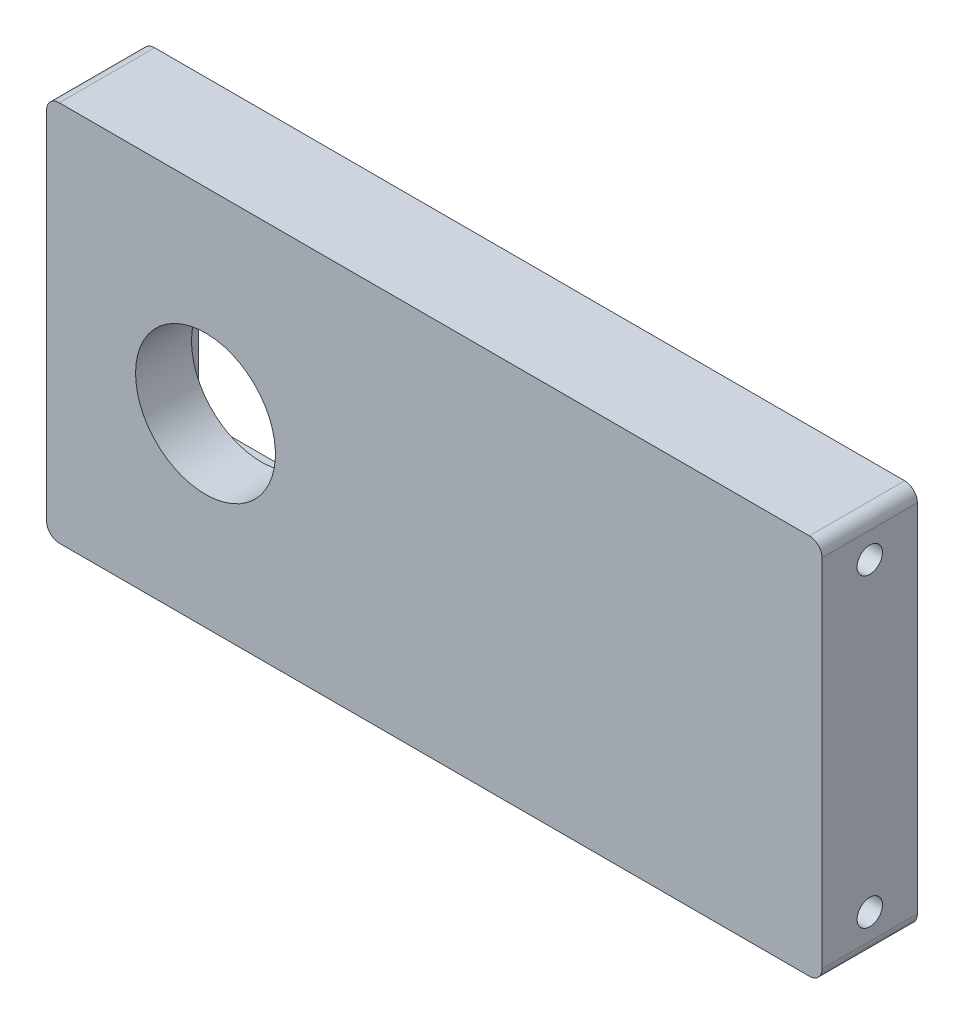
ISO-10303-21;
HEADER;
FILE_DESCRIPTION(('STEP AP214'),'2;1');
FILE_NAME('part.step','',(''),(''),'','','');
FILE_SCHEMA(('AUTOMOTIVE_DESIGN { 1 0 10303 214 1 1 1 1 }'));
ENDSEC;
DATA;
#1=APPLICATION_CONTEXT('core data for automotive mechanical design processes');
#2=APPLICATION_PROTOCOL_DEFINITION('international standard','automotive_design',2000,#1);
#3=PRODUCT_CONTEXT('',#1,'mechanical');
#4=PRODUCT('Part','Part','',(#3));
#5=PRODUCT_RELATED_PRODUCT_CATEGORY('part','',(#4));
#6=PRODUCT_DEFINITION_FORMATION('','',#4);
#7=PRODUCT_DEFINITION_CONTEXT('part definition',#1,'design');
#8=PRODUCT_DEFINITION('design','',#6,#7);
#9=PRODUCT_DEFINITION_SHAPE('','',#8);
#10=(LENGTH_UNIT() NAMED_UNIT(*) SI_UNIT(.MILLI.,.METRE.));
#11=(NAMED_UNIT(*) PLANE_ANGLE_UNIT() SI_UNIT($,.RADIAN.));
#12=(NAMED_UNIT(*) SI_UNIT($,.STERADIAN.) SOLID_ANGLE_UNIT());
#13=UNCERTAINTY_MEASURE_WITH_UNIT(LENGTH_MEASURE(1.E-05),#10,'distance_accuracy_value','');
#14=(GEOMETRIC_REPRESENTATION_CONTEXT(3) GLOBAL_UNCERTAINTY_ASSIGNED_CONTEXT((#13)) GLOBAL_UNIT_ASSIGNED_CONTEXT((#10,
#11,#12)) REPRESENTATION_CONTEXT('',''));
#15=CARTESIAN_POINT('',(0.,0.,0.));
#16=DIRECTION('',(0.,0.,1.));
#17=DIRECTION('',(1.,0.,0.));
#18=AXIS2_PLACEMENT_3D('',#15,#16,#17);
#19=CARTESIAN_POINT('',(-36.,-0.850791996043654,27.5));
#20=DIRECTION('',(0.,0.,-1.));
#21=DIRECTION('',(-1.,0.,0.));
#22=AXIS2_PLACEMENT_3D('',#19,#20,#21);
#23=CYLINDRICAL_SURFACE('',#22,11.);
#24=CARTESIAN_POINT('',(-36.,-0.850791996043654,7.5));
#25=DIRECTION('',(0.,0.,-1.));
#26=DIRECTION('',(-1.,0.,0.));
#27=AXIS2_PLACEMENT_3D('',#24,#25,#26);
#28=CIRCLE('',#27,11.);
#29=CARTESIAN_POINT('',(-47.,-0.850791996043654,7.5));
#30=VERTEX_POINT('',#29);
#31=EDGE_CURVE('E228',#30,#30,#28,.T.);
#32=ORIENTED_EDGE('',*,*,#31,.F.);
#33=EDGE_LOOP('',(#32));
#34=FACE_BOUND('',#33,.T.);
#35=CARTESIAN_POINT('',(-36.,-0.850791996043654,-1.3));
#36=DIRECTION('',(0.,0.,-1.));
#37=DIRECTION('',(-1.,0.,0.));
#38=AXIS2_PLACEMENT_3D('',#35,#36,#37);
#39=CIRCLE('',#38,11.);
#40=CARTESIAN_POINT('',(-47.,-0.850791996043654,-1.3));
#41=VERTEX_POINT('',#40);
#42=EDGE_CURVE('E43',#41,#41,#39,.F.);
#43=ORIENTED_EDGE('',*,*,#42,.F.);
#44=EDGE_LOOP('',(#43));
#45=FACE_BOUND('',#44,.T.);
#46=ADVANCED_FACE('F39',(#34,#45),#23,.F.);
#47=CARTESIAN_POINT('',(59.,28.,7.5));
#48=DIRECTION('',(0.,0.,-1.));
#49=DIRECTION('',(-1.,0.,0.));
#50=AXIS2_PLACEMENT_3D('',#47,#48,#49);
#51=CYLINDRICAL_SURFACE('',#50,2.00000000000001);
#52=CARTESIAN_POINT('',(59.,28.,-7.5));
#53=DIRECTION('',(0.,0.,1.));
#54=DIRECTION('',(-1.,0.,0.));
#55=AXIS2_PLACEMENT_3D('',#52,#53,#54);
#56=CIRCLE('',#55,2.00000000000001);
#57=CARTESIAN_POINT('',(61.,28.,-7.5));
#58=VERTEX_POINT('',#57);
#59=CARTESIAN_POINT('',(59.,30.,-7.5));
#60=VERTEX_POINT('',#59);
#61=EDGE_CURVE('E154',#58,#60,#56,.T.);
#62=ORIENTED_EDGE('',*,*,#61,.T.);
#63=DIRECTION('',(0.,0.,-1.));
#64=VECTOR('',#63,1.);
#65=CARTESIAN_POINT('',(59.,30.,7.5));
#66=LINE('',#65,#64);
#67=CARTESIAN_POINT('',(59.,30.,7.5));
#68=VERTEX_POINT('',#67);
#69=EDGE_CURVE('E11',#68,#60,#66,.T.);
#70=ORIENTED_EDGE('',*,*,#69,.F.);
#71=CARTESIAN_POINT('',(59.,28.,7.5));
#72=DIRECTION('',(0.,0.,1.));
#73=DIRECTION('',(-1.,0.,0.));
#74=AXIS2_PLACEMENT_3D('',#71,#72,#73);
#75=CIRCLE('',#74,2.00000000000001);
#76=CARTESIAN_POINT('',(61.,28.,7.5));
#77=VERTEX_POINT('',#76);
#78=EDGE_CURVE('E178',#77,#68,#75,.T.);
#79=ORIENTED_EDGE('',*,*,#78,.F.);
#80=DIRECTION('',(0.,0.,-1.));
#81=VECTOR('',#80,1.);
#82=CARTESIAN_POINT('',(61.,28.,7.5));
#83=LINE('',#82,#81);
#84=EDGE_CURVE('E150',#77,#58,#83,.T.);
#85=ORIENTED_EDGE('',*,*,#84,.T.);
#86=EDGE_LOOP('',(#62,#70,#79,#85));
#87=FACE_BOUND('',#86,.T.);
#88=ADVANCED_FACE('F41',(#87),#51,.T.);
#89=CARTESIAN_POINT('',(-59.,30.,7.5));
#90=DIRECTION('',(0.,-1.,0.));
#91=DIRECTION('',(0.,0.,-1.));
#92=AXIS2_PLACEMENT_3D('',#89,#90,#91);
#93=PLANE('',#92);
#94=DIRECTION('',(-1.,0.,0.));
#95=VECTOR('',#94,1.);
#96=CARTESIAN_POINT('',(-59.,30.,-7.5));
#97=LINE('',#96,#95);
#98=CARTESIAN_POINT('',(-59.,30.,-7.5));
#99=VERTEX_POINT('',#98);
#100=EDGE_CURVE('E158',#60,#99,#97,.T.);
#101=ORIENTED_EDGE('',*,*,#100,.T.);
#102=DIRECTION('',(0.,0.,-1.));
#103=VECTOR('',#102,1.);
#104=CARTESIAN_POINT('',(-59.,30.,7.5));
#105=LINE('',#104,#103);
#106=CARTESIAN_POINT('',(-59.,30.,7.5));
#107=VERTEX_POINT('',#106);
#108=EDGE_CURVE('E49',#107,#99,#105,.T.);
#109=ORIENTED_EDGE('',*,*,#108,.F.);
#110=DIRECTION('',(-1.,0.,0.));
#111=VECTOR('',#110,1.);
#112=CARTESIAN_POINT('',(-59.,30.,7.5));
#113=LINE('',#112,#111);
#114=EDGE_CURVE('E106',#68,#107,#113,.T.);
#115=ORIENTED_EDGE('',*,*,#114,.F.);
#116=ORIENTED_EDGE('',*,*,#69,.T.);
#117=EDGE_LOOP('',(#101,#109,#115,#116));
#118=FACE_BOUND('',#117,.T.);
#119=ADVANCED_FACE('F414',(#118),#93,.F.);
#120=CARTESIAN_POINT('',(-59.,28.,7.5));
#121=DIRECTION('',(0.,0.,-1.));
#122=DIRECTION('',(-1.,0.,0.));
#123=AXIS2_PLACEMENT_3D('',#120,#121,#122);
#124=CYLINDRICAL_SURFACE('',#123,2.);
#125=CARTESIAN_POINT('',(-59.,28.,-7.5));
#126=DIRECTION('',(0.,0.,1.));
#127=DIRECTION('',(1.,0.,0.));
#128=AXIS2_PLACEMENT_3D('',#125,#126,#127);
#129=CIRCLE('',#128,2.);
#130=CARTESIAN_POINT('',(-61.,28.,-7.5));
#131=VERTEX_POINT('',#130);
#132=EDGE_CURVE('E162',#99,#131,#129,.T.);
#133=ORIENTED_EDGE('',*,*,#132,.T.);
#134=DIRECTION('',(0.,0.,-1.));
#135=VECTOR('',#134,1.);
#136=CARTESIAN_POINT('',(-61.,28.,7.5));
#137=LINE('',#136,#135);
#138=CARTESIAN_POINT('',(-61.,28.,7.5));
#139=VERTEX_POINT('',#138);
#140=EDGE_CURVE('E189',#139,#131,#137,.T.);
#141=ORIENTED_EDGE('',*,*,#140,.F.);
#142=CARTESIAN_POINT('',(-59.,28.,7.5));
#143=DIRECTION('',(0.,0.,1.));
#144=DIRECTION('',(1.,0.,0.));
#145=AXIS2_PLACEMENT_3D('',#142,#143,#144);
#146=CIRCLE('',#145,2.);
#147=EDGE_CURVE('E200',#107,#139,#146,.T.);
#148=ORIENTED_EDGE('',*,*,#147,.F.);
#149=ORIENTED_EDGE('',*,*,#108,.T.);
#150=EDGE_LOOP('',(#133,#141,#148,#149));
#151=FACE_BOUND('',#150,.T.);
#152=ADVANCED_FACE('F198',(#151),#124,.T.);
#153=CARTESIAN_POINT('',(-61.,28.,7.5));
#154=DIRECTION('',(1.,0.,0.));
#155=DIRECTION('',(0.,1.,0.));
#156=AXIS2_PLACEMENT_3D('',#153,#154,#155);
#157=PLANE('',#156);
#158=DIRECTION('',(0.,-1.,0.));
#159=VECTOR('',#158,1.);
#160=CARTESIAN_POINT('',(-61.,28.,-7.5));
#161=LINE('',#160,#159);
#162=CARTESIAN_POINT('',(-61.,-28.,-7.5));
#163=VERTEX_POINT('',#162);
#164=EDGE_CURVE('E165',#131,#163,#161,.T.);
#165=ORIENTED_EDGE('',*,*,#164,.T.);
#166=DIRECTION('',(0.,0.,-1.));
#167=VECTOR('',#166,1.);
#168=CARTESIAN_POINT('',(-61.,-28.,7.5));
#169=LINE('',#168,#167);
#170=CARTESIAN_POINT('',(-61.,-28.,7.5));
#171=VERTEX_POINT('',#170);
#172=EDGE_CURVE('E185',#171,#163,#169,.T.);
#173=ORIENTED_EDGE('',*,*,#172,.F.);
#174=DIRECTION('',(0.,-1.,0.));
#175=VECTOR('',#174,1.);
#176=CARTESIAN_POINT('',(-61.,28.,7.5));
#177=LINE('',#176,#175);
#178=EDGE_CURVE('E213',#139,#171,#177,.T.);
#179=ORIENTED_EDGE('',*,*,#178,.F.);
#180=ORIENTED_EDGE('',*,*,#140,.T.);
#181=EDGE_LOOP('',(#165,#173,#179,#180));
#182=FACE_BOUND('',#181,.T.);
#183=ADVANCED_FACE('F208',(#182),#157,.F.);
#184=CARTESIAN_POINT('',(-59.,-28.,7.5));
#185=DIRECTION('',(0.,0.,-1.));
#186=DIRECTION('',(-1.,0.,0.));
#187=AXIS2_PLACEMENT_3D('',#184,#185,#186);
#188=CYLINDRICAL_SURFACE('',#187,2.);
#189=CARTESIAN_POINT('',(-59.,-28.,-7.5));
#190=DIRECTION('',(0.,0.,1.));
#191=DIRECTION('',(1.,0.,0.));
#192=AXIS2_PLACEMENT_3D('',#189,#190,#191);
#193=CIRCLE('',#192,2.);
#194=CARTESIAN_POINT('',(-59.,-30.,-7.5));
#195=VERTEX_POINT('',#194);
#196=EDGE_CURVE('E168',#163,#195,#193,.T.);
#197=ORIENTED_EDGE('',*,*,#196,.T.);
#198=DIRECTION('',(0.,0.,-1.));
#199=VECTOR('',#198,1.);
#200=CARTESIAN_POINT('',(-59.,-30.,7.5));
#201=LINE('',#200,#199);
#202=CARTESIAN_POINT('',(-59.,-30.,7.5));
#203=VERTEX_POINT('',#202);
#204=EDGE_CURVE('E143',#203,#195,#201,.T.);
#205=ORIENTED_EDGE('',*,*,#204,.F.);
#206=CARTESIAN_POINT('',(-59.,-28.,7.5));
#207=DIRECTION('',(0.,0.,1.));
#208=DIRECTION('',(1.,0.,0.));
#209=AXIS2_PLACEMENT_3D('',#206,#207,#208);
#210=CIRCLE('',#209,2.);
#211=EDGE_CURVE('E129',#171,#203,#210,.T.);
#212=ORIENTED_EDGE('',*,*,#211,.F.);
#213=ORIENTED_EDGE('',*,*,#172,.T.);
#214=EDGE_LOOP('',(#197,#205,#212,#213));
#215=FACE_BOUND('',#214,.T.);
#216=ADVANCED_FACE('F211',(#215),#188,.T.);
#217=CARTESIAN_POINT('',(-59.,-30.,7.5));
#218=DIRECTION('',(0.,1.,0.));
#219=DIRECTION('',(0.,0.,1.));
#220=AXIS2_PLACEMENT_3D('',#217,#218,#219);
#221=PLANE('',#220);
#222=DIRECTION('',(1.,0.,0.));
#223=VECTOR('',#222,1.);
#224=CARTESIAN_POINT('',(-59.,-30.,-7.5));
#225=LINE('',#224,#223);
#226=CARTESIAN_POINT('',(59.,-30.,-7.5));
#227=VERTEX_POINT('',#226);
#228=EDGE_CURVE('E139',#195,#227,#225,.T.);
#229=ORIENTED_EDGE('',*,*,#228,.T.);
#230=DIRECTION('',(0.,0.,-1.));
#231=VECTOR('',#230,1.);
#232=CARTESIAN_POINT('',(59.,-30.,7.5));
#233=LINE('',#232,#231);
#234=CARTESIAN_POINT('',(59.,-30.,7.5));
#235=VERTEX_POINT('',#234);
#236=EDGE_CURVE('E136',#235,#227,#233,.T.);
#237=ORIENTED_EDGE('',*,*,#236,.F.);
#238=DIRECTION('',(1.,0.,0.));
#239=VECTOR('',#238,1.);
#240=CARTESIAN_POINT('',(-59.,-30.,7.5));
#241=LINE('',#240,#239);
#242=EDGE_CURVE('E122',#203,#235,#241,.T.);
#243=ORIENTED_EDGE('',*,*,#242,.F.);
#244=ORIENTED_EDGE('',*,*,#204,.T.);
#245=EDGE_LOOP('',(#229,#237,#243,#244));
#246=FACE_BOUND('',#245,.T.);
#247=ADVANCED_FACE('F137',(#246),#221,.F.);
#248=CARTESIAN_POINT('',(59.,-28.,7.5));
#249=DIRECTION('',(0.,0.,-1.));
#250=DIRECTION('',(-1.,0.,0.));
#251=AXIS2_PLACEMENT_3D('',#248,#249,#250);
#252=CYLINDRICAL_SURFACE('',#251,2.00000000000001);
#253=CARTESIAN_POINT('',(59.,-28.,-7.5));
#254=DIRECTION('',(0.,0.,1.));
#255=DIRECTION('',(1.,0.,0.));
#256=AXIS2_PLACEMENT_3D('',#253,#254,#255);
#257=CIRCLE('',#256,2.00000000000001);
#258=CARTESIAN_POINT('',(61.,-28.,-7.5));
#259=VERTEX_POINT('',#258);
#260=EDGE_CURVE('E173',#227,#259,#257,.T.);
#261=ORIENTED_EDGE('',*,*,#260,.T.);
#262=DIRECTION('',(0.,0.,-1.));
#263=VECTOR('',#262,1.);
#264=CARTESIAN_POINT('',(61.,-28.,7.5));
#265=LINE('',#264,#263);
#266=CARTESIAN_POINT('',(61.,-28.,7.5));
#267=VERTEX_POINT('',#266);
#268=EDGE_CURVE('E144',#267,#259,#265,.T.);
#269=ORIENTED_EDGE('',*,*,#268,.F.);
#270=CARTESIAN_POINT('',(59.,-28.,7.5));
#271=DIRECTION('',(0.,0.,1.));
#272=DIRECTION('',(1.,0.,0.));
#273=AXIS2_PLACEMENT_3D('',#270,#271,#272);
#274=CIRCLE('',#273,2.00000000000001);
#275=EDGE_CURVE('E126',#235,#267,#274,.T.);
#276=ORIENTED_EDGE('',*,*,#275,.F.);
#277=ORIENTED_EDGE('',*,*,#236,.T.);
#278=EDGE_LOOP('',(#261,#269,#276,#277));
#279=FACE_BOUND('',#278,.T.);
#280=ADVANCED_FACE('F146',(#279),#252,.T.);
#281=CARTESIAN_POINT('',(61.,28.,7.5));
#282=DIRECTION('',(-1.,0.,0.));
#283=DIRECTION('',(0.,0.,1.));
#284=AXIS2_PLACEMENT_3D('',#281,#282,#283);
#285=PLANE('',#284);
#286=CARTESIAN_POINT('',(61.,24.,0.));
#287=DIRECTION('',(1.,0.,0.));
#288=DIRECTION('',(0.,1.,0.));
#289=AXIS2_PLACEMENT_3D('',#286,#287,#288);
#290=CIRCLE('',#289,2.);
#291=CARTESIAN_POINT('',(61.,26.,0.));
#292=VERTEX_POINT('',#291);
#293=EDGE_CURVE('E232',#292,#292,#290,.T.);
#294=ORIENTED_EDGE('',*,*,#293,.F.);
#295=EDGE_LOOP('',(#294));
#296=FACE_BOUND('',#295,.T.);
#297=CARTESIAN_POINT('',(61.,-24.,0.));
#298=DIRECTION('',(1.,0.,0.));
#299=DIRECTION('',(0.,-1.,0.));
#300=AXIS2_PLACEMENT_3D('',#297,#298,#299);
#301=CIRCLE('',#300,2.);
#302=CARTESIAN_POINT('',(61.,-26.,0.));
#303=VERTEX_POINT('',#302);
#304=EDGE_CURVE('E223',#303,#303,#301,.T.);
#305=ORIENTED_EDGE('',*,*,#304,.F.);
#306=EDGE_LOOP('',(#305));
#307=FACE_BOUND('',#306,.T.);
#308=DIRECTION('',(0.,1.,0.));
#309=VECTOR('',#308,1.);
#310=CARTESIAN_POINT('',(61.,28.,-7.5));
#311=LINE('',#310,#309);
#312=EDGE_CURVE('E98',#259,#58,#311,.T.);
#313=ORIENTED_EDGE('',*,*,#312,.T.);
#314=ORIENTED_EDGE('',*,*,#84,.F.);
#315=DIRECTION('',(0.,1.,0.));
#316=VECTOR('',#315,1.);
#317=CARTESIAN_POINT('',(61.,28.,7.5));
#318=LINE('',#317,#316);
#319=EDGE_CURVE('E65',#267,#77,#318,.T.);
#320=ORIENTED_EDGE('',*,*,#319,.F.);
#321=ORIENTED_EDGE('',*,*,#268,.T.);
#322=EDGE_LOOP('',(#313,#314,#320,#321));
#323=FACE_BOUND('',#322,.T.);
#324=ADVANCED_FACE('F439',(#296,#307,#323),#285,.F.);
#325=CARTESIAN_POINT('',(59.,28.,7.5));
#326=DIRECTION('',(0.,0.,-1.));
#327=DIRECTION('',(-1.,0.,0.));
#328=AXIS2_PLACEMENT_3D('',#325,#326,#327);
#329=PLANE('',#328);
#330=ORIENTED_EDGE('',*,*,#31,.T.);
#331=EDGE_LOOP('',(#330));
#332=FACE_BOUND('',#331,.T.);
#333=ORIENTED_EDGE('',*,*,#78,.T.);
#334=ORIENTED_EDGE('',*,*,#114,.T.);
#335=ORIENTED_EDGE('',*,*,#147,.T.);
#336=ORIENTED_EDGE('',*,*,#178,.T.);
#337=ORIENTED_EDGE('',*,*,#211,.T.);
#338=ORIENTED_EDGE('',*,*,#242,.T.);
#339=ORIENTED_EDGE('',*,*,#275,.T.);
#340=ORIENTED_EDGE('',*,*,#319,.T.);
#341=EDGE_LOOP('',(#333,#334,#335,#336,#337,#338,#339,#340));
#342=FACE_BOUND('',#341,.T.);
#343=ADVANCED_FACE('F124',(#332,#342),#329,.F.);
#344=CARTESIAN_POINT('',(59.,28.,-7.5));
#345=DIRECTION('',(0.,0.,-1.));
#346=DIRECTION('',(-1.,0.,0.));
#347=AXIS2_PLACEMENT_3D('',#344,#345,#346);
#348=PLANE('',#347);
#349=DIRECTION('',(0.,1.,0.));
#350=VECTOR('',#349,1.);
#351=CARTESIAN_POINT('',(-52.1,12.2492080039563,-7.5));
#352=LINE('',#351,#350);
#353=CARTESIAN_POINT('',(-52.1,-13.9507919960437,-7.5));
#354=VERTEX_POINT('',#353);
#355=CARTESIAN_POINT('',(-52.1,12.2492080039563,-7.5));
#356=VERTEX_POINT('',#355);
#357=EDGE_CURVE('E56',#354,#356,#352,.T.);
#358=ORIENTED_EDGE('',*,*,#357,.F.);
#359=DIRECTION('',(-0.707106781186549,0.707106781186546,0.));
#360=VECTOR('',#359,1.);
#361=CARTESIAN_POINT('',(-52.1,-13.9507919960437,-7.5));
#362=LINE('',#361,#360);
#363=CARTESIAN_POINT('',(-49.1,-16.9507919960437,-7.5));
#364=VERTEX_POINT('',#363);
#365=EDGE_CURVE('E273',#364,#354,#362,.T.);
#366=ORIENTED_EDGE('',*,*,#365,.F.);
#367=DIRECTION('',(-1.,0.,0.));
#368=VECTOR('',#367,1.);
#369=CARTESIAN_POINT('',(-22.9,-16.9507919960437,-7.5));
#370=LINE('',#369,#368);
#371=CARTESIAN_POINT('',(-22.9,-16.9507919960437,-7.5));
#372=VERTEX_POINT('',#371);
#373=EDGE_CURVE('E278',#372,#364,#370,.T.);
#374=ORIENTED_EDGE('',*,*,#373,.F.);
#375=DIRECTION('',(-0.707106781186548,-0.707106781186548,0.));
#376=VECTOR('',#375,1.);
#377=CARTESIAN_POINT('',(-19.9,-13.9507919960437,-7.5));
#378=LINE('',#377,#376);
#379=CARTESIAN_POINT('',(-19.9,-13.9507919960437,-7.5));
#380=VERTEX_POINT('',#379);
#381=EDGE_CURVE('E282',#380,#372,#378,.T.);
#382=ORIENTED_EDGE('',*,*,#381,.F.);
#383=DIRECTION('',(0.,-1.,0.));
#384=VECTOR('',#383,1.);
#385=CARTESIAN_POINT('',(-19.9,12.2492080039563,-7.5));
#386=LINE('',#385,#384);
#387=CARTESIAN_POINT('',(-19.9,12.2492080039563,-7.5));
#388=VERTEX_POINT('',#387);
#389=EDGE_CURVE('E286',#388,#380,#386,.T.);
#390=ORIENTED_EDGE('',*,*,#389,.F.);
#391=DIRECTION('',(0.707106781186547,-0.707106781186548,0.));
#392=VECTOR('',#391,1.);
#393=CARTESIAN_POINT('',(-22.9,15.2492080039563,-7.5));
#394=LINE('',#393,#392);
#395=CARTESIAN_POINT('',(-22.9,15.2492080039563,-7.5));
#396=VERTEX_POINT('',#395);
#397=EDGE_CURVE('E290',#396,#388,#394,.T.);
#398=ORIENTED_EDGE('',*,*,#397,.F.);
#399=DIRECTION('',(1.,0.,0.));
#400=VECTOR('',#399,1.);
#401=CARTESIAN_POINT('',(-22.9,15.2492080039563,-7.5));
#402=LINE('',#401,#400);
#403=CARTESIAN_POINT('',(-49.1,15.2492080039563,-7.5));
#404=VERTEX_POINT('',#403);
#405=EDGE_CURVE('E294',#404,#396,#402,.T.);
#406=ORIENTED_EDGE('',*,*,#405,.F.);
#407=DIRECTION('',(0.707106781186547,0.707106781186548,0.));
#408=VECTOR('',#407,1.);
#409=CARTESIAN_POINT('',(-49.1,15.2492080039563,-7.5));
#410=LINE('',#409,#408);
#411=EDGE_CURVE('E298',#356,#404,#410,.T.);
#412=ORIENTED_EDGE('',*,*,#411,.F.);
#413=EDGE_LOOP('',(#358,#366,#374,#382,#390,#398,#406,#412));
#414=FACE_BOUND('',#413,.T.);
#415=ORIENTED_EDGE('',*,*,#61,.F.);
#416=ORIENTED_EDGE('',*,*,#312,.F.);
#417=ORIENTED_EDGE('',*,*,#260,.F.);
#418=ORIENTED_EDGE('',*,*,#228,.F.);
#419=ORIENTED_EDGE('',*,*,#196,.F.);
#420=ORIENTED_EDGE('',*,*,#164,.F.);
#421=ORIENTED_EDGE('',*,*,#132,.F.);
#422=ORIENTED_EDGE('',*,*,#100,.F.);
#423=EDGE_LOOP('',(#415,#416,#417,#418,#419,#420,#421,#422));
#424=FACE_BOUND('',#423,.T.);
#425=ADVANCED_FACE('F204',(#414,#424),#348,.T.);
#426=CARTESIAN_POINT('',(46.,-24.,0.));
#427=DIRECTION('',(1.,0.,0.));
#428=DIRECTION('',(0.,1.,0.));
#429=AXIS2_PLACEMENT_3D('',#426,#427,#428);
#430=CYLINDRICAL_SURFACE('',#429,2.);
#431=CARTESIAN_POINT('',(46.,-24.,0.));
#432=DIRECTION('',(1.,0.,0.));
#433=DIRECTION('',(0.,-1.,0.));
#434=AXIS2_PLACEMENT_3D('',#431,#432,#433);
#435=CIRCLE('',#434,2.);
#436=CARTESIAN_POINT('',(46.,-26.,0.));
#437=VERTEX_POINT('',#436);
#438=EDGE_CURVE('E227',#437,#437,#435,.T.);
#439=ORIENTED_EDGE('',*,*,#438,.F.);
#440=EDGE_LOOP('',(#439));
#441=FACE_BOUND('',#440,.T.);
#442=ORIENTED_EDGE('',*,*,#304,.T.);
#443=EDGE_LOOP('',(#442));
#444=FACE_BOUND('',#443,.T.);
#445=ADVANCED_FACE('F432',(#441,#444),#430,.F.);
#446=CARTESIAN_POINT('',(46.,-24.,0.));
#447=DIRECTION('',(-1.,0.,0.));
#448=DIRECTION('',(0.,-1.,0.));
#449=AXIS2_PLACEMENT_3D('',#446,#447,#448);
#450=PLANE('',#449);
#451=ORIENTED_EDGE('',*,*,#438,.T.);
#452=EDGE_LOOP('',(#451));
#453=FACE_BOUND('',#452,.T.);
#454=ADVANCED_FACE('F428',(#453),#450,.F.);
#455=CARTESIAN_POINT('',(46.,24.,0.));
#456=DIRECTION('',(1.,0.,0.));
#457=DIRECTION('',(0.,1.,0.));
#458=AXIS2_PLACEMENT_3D('',#455,#456,#457);
#459=CYLINDRICAL_SURFACE('',#458,2.);
#460=CARTESIAN_POINT('',(46.,24.,0.));
#461=DIRECTION('',(1.,0.,0.));
#462=DIRECTION('',(0.,1.,0.));
#463=AXIS2_PLACEMENT_3D('',#460,#461,#462);
#464=CIRCLE('',#463,2.);
#465=CARTESIAN_POINT('',(46.,26.,0.));
#466=VERTEX_POINT('',#465);
#467=EDGE_CURVE('E159',#466,#466,#464,.T.);
#468=ORIENTED_EDGE('',*,*,#467,.F.);
#469=EDGE_LOOP('',(#468));
#470=FACE_BOUND('',#469,.T.);
#471=ORIENTED_EDGE('',*,*,#293,.T.);
#472=EDGE_LOOP('',(#471));
#473=FACE_BOUND('',#472,.T.);
#474=ADVANCED_FACE('F424',(#470,#473),#459,.F.);
#475=CARTESIAN_POINT('',(46.,24.,0.));
#476=DIRECTION('',(1.,0.,0.));
#477=DIRECTION('',(0.,1.,0.));
#478=AXIS2_PLACEMENT_3D('',#475,#476,#477);
#479=PLANE('',#478);
#480=ORIENTED_EDGE('',*,*,#467,.T.);
#481=EDGE_LOOP('',(#480));
#482=FACE_BOUND('',#481,.T.);
#483=ADVANCED_FACE('F421',(#482),#479,.T.);
#484=CARTESIAN_POINT('',(0.,0.,-1.3));
#485=DIRECTION('',(0.,0.,-1.));
#486=DIRECTION('',(-1.,0.,0.));
#487=AXIS2_PLACEMENT_3D('',#484,#485,#486);
#488=PLANE('',#487);
#489=DIRECTION('',(0.,1.,0.));
#490=VECTOR('',#489,1.);
#491=CARTESIAN_POINT('',(-52.1,12.2492080039563,-1.3));
#492=LINE('',#491,#490);
#493=CARTESIAN_POINT('',(-52.1,-13.9507919960437,-1.3));
#494=VERTEX_POINT('',#493);
#495=CARTESIAN_POINT('',(-52.1,12.2492080039563,-1.3));
#496=VERTEX_POINT('',#495);
#497=EDGE_CURVE('E277',#494,#496,#492,.T.);
#498=ORIENTED_EDGE('',*,*,#497,.T.);
#499=DIRECTION('',(0.707106781186547,0.707106781186548,0.));
#500=VECTOR('',#499,1.);
#501=CARTESIAN_POINT('',(-49.1,15.2492080039563,-1.3));
#502=LINE('',#501,#500);
#503=CARTESIAN_POINT('',(-49.1,15.2492080039563,-1.3));
#504=VERTEX_POINT('',#503);
#505=EDGE_CURVE('E327',#496,#504,#502,.T.);
#506=ORIENTED_EDGE('',*,*,#505,.T.);
#507=DIRECTION('',(1.,0.,0.));
#508=VECTOR('',#507,1.);
#509=CARTESIAN_POINT('',(-22.9,15.2492080039563,-1.3));
#510=LINE('',#509,#508);
#511=CARTESIAN_POINT('',(-22.9,15.2492080039563,-1.3));
#512=VERTEX_POINT('',#511);
#513=EDGE_CURVE('E323',#504,#512,#510,.T.);
#514=ORIENTED_EDGE('',*,*,#513,.T.);
#515=DIRECTION('',(0.707106781186547,-0.707106781186548,0.));
#516=VECTOR('',#515,1.);
#517=CARTESIAN_POINT('',(-22.9,15.2492080039563,-1.3));
#518=LINE('',#517,#516);
#519=CARTESIAN_POINT('',(-19.9,12.2492080039563,-1.3));
#520=VERTEX_POINT('',#519);
#521=EDGE_CURVE('E319',#512,#520,#518,.T.);
#522=ORIENTED_EDGE('',*,*,#521,.T.);
#523=DIRECTION('',(0.,-1.,0.));
#524=VECTOR('',#523,1.);
#525=CARTESIAN_POINT('',(-19.9,12.2492080039563,-1.3));
#526=LINE('',#525,#524);
#527=CARTESIAN_POINT('',(-19.9,-13.9507919960437,-1.3));
#528=VERTEX_POINT('',#527);
#529=EDGE_CURVE('E315',#520,#528,#526,.T.);
#530=ORIENTED_EDGE('',*,*,#529,.T.);
#531=DIRECTION('',(-0.707106781186548,-0.707106781186548,0.));
#532=VECTOR('',#531,1.);
#533=CARTESIAN_POINT('',(-19.9,-13.9507919960437,-1.3));
#534=LINE('',#533,#532);
#535=CARTESIAN_POINT('',(-22.9,-16.9507919960437,-1.3));
#536=VERTEX_POINT('',#535);
#537=EDGE_CURVE('E311',#528,#536,#534,.T.);
#538=ORIENTED_EDGE('',*,*,#537,.T.);
#539=DIRECTION('',(-1.,0.,0.));
#540=VECTOR('',#539,1.);
#541=CARTESIAN_POINT('',(-22.9,-16.9507919960437,-1.3));
#542=LINE('',#541,#540);
#543=CARTESIAN_POINT('',(-49.1,-16.9507919960437,-1.3));
#544=VERTEX_POINT('',#543);
#545=EDGE_CURVE('E307',#536,#544,#542,.T.);
#546=ORIENTED_EDGE('',*,*,#545,.T.);
#547=DIRECTION('',(-0.707106781186549,0.707106781186546,0.));
#548=VECTOR('',#547,1.);
#549=CARTESIAN_POINT('',(-52.1,-13.9507919960437,-1.3));
#550=LINE('',#549,#548);
#551=EDGE_CURVE('E246',#544,#494,#550,.T.);
#552=ORIENTED_EDGE('',*,*,#551,.T.);
#553=EDGE_LOOP('',(#498,#506,#514,#522,#530,#538,#546,#552));
#554=FACE_BOUND('',#553,.T.);
#555=ORIENTED_EDGE('',*,*,#42,.T.);
#556=EDGE_LOOP('',(#555));
#557=FACE_BOUND('',#556,.T.);
#558=ADVANCED_FACE('F336',(#554,#557),#488,.T.);
#559=CARTESIAN_POINT('',(-52.1,12.2492080039563,-1.3));
#560=DIRECTION('',(-1.,0.,0.));
#561=DIRECTION('',(0.,-1.,0.));
#562=AXIS2_PLACEMENT_3D('',#559,#560,#561);
#563=PLANE('',#562);
#564=ORIENTED_EDGE('',*,*,#357,.T.);
#565=DIRECTION('',(0.,0.,-1.));
#566=VECTOR('',#565,1.);
#567=CARTESIAN_POINT('',(-52.1,12.2492080039563,-1.3));
#568=LINE('',#567,#566);
#569=EDGE_CURVE('E242',#496,#356,#568,.T.);
#570=ORIENTED_EDGE('',*,*,#569,.F.);
#571=ORIENTED_EDGE('',*,*,#497,.F.);
#572=DIRECTION('',(0.,0.,-1.));
#573=VECTOR('',#572,1.);
#574=CARTESIAN_POINT('',(-52.1,-13.9507919960437,-1.3));
#575=LINE('',#574,#573);
#576=EDGE_CURVE('E270',#494,#354,#575,.T.);
#577=ORIENTED_EDGE('',*,*,#576,.T.);
#578=EDGE_LOOP('',(#564,#570,#571,#577));
#579=FACE_BOUND('',#578,.T.);
#580=ADVANCED_FACE('F342',(#579),#563,.F.);
#581=CARTESIAN_POINT('',(-52.1,-13.9507919960437,-1.3));
#582=DIRECTION('',(-0.707106781186546,-0.707106781186549,0.));
#583=DIRECTION('',(0.707106781186549,-0.707106781186546,0.));
#584=AXIS2_PLACEMENT_3D('',#581,#582,#583);
#585=PLANE('',#584);
#586=ORIENTED_EDGE('',*,*,#365,.T.);
#587=ORIENTED_EDGE('',*,*,#576,.F.);
#588=ORIENTED_EDGE('',*,*,#551,.F.);
#589=DIRECTION('',(0.,0.,-1.));
#590=VECTOR('',#589,1.);
#591=CARTESIAN_POINT('',(-49.1,-16.9507919960437,-1.3));
#592=LINE('',#591,#590);
#593=EDGE_CURVE('E266',#544,#364,#592,.T.);
#594=ORIENTED_EDGE('',*,*,#593,.T.);
#595=EDGE_LOOP('',(#586,#587,#588,#594));
#596=FACE_BOUND('',#595,.T.);
#597=ADVANCED_FACE('F362',(#596),#585,.F.);
#598=CARTESIAN_POINT('',(-22.9,-16.9507919960437,-1.3));
#599=DIRECTION('',(0.,-1.,0.));
#600=DIRECTION('',(0.,0.,-1.));
#601=AXIS2_PLACEMENT_3D('',#598,#599,#600);
#602=PLANE('',#601);
#603=ORIENTED_EDGE('',*,*,#373,.T.);
#604=ORIENTED_EDGE('',*,*,#593,.F.);
#605=ORIENTED_EDGE('',*,*,#545,.F.);
#606=DIRECTION('',(0.,0.,-1.));
#607=VECTOR('',#606,1.);
#608=CARTESIAN_POINT('',(-22.9,-16.9507919960437,-1.3));
#609=LINE('',#608,#607);
#610=EDGE_CURVE('E262',#536,#372,#609,.T.);
#611=ORIENTED_EDGE('',*,*,#610,.T.);
#612=EDGE_LOOP('',(#603,#604,#605,#611));
#613=FACE_BOUND('',#612,.T.);
#614=ADVANCED_FACE('F367',(#613),#602,.F.);
#615=CARTESIAN_POINT('',(-19.9,-13.9507919960437,-1.3));
#616=DIRECTION('',(0.707106781186547,-0.707106781186547,0.));
#617=DIRECTION('',(0.707106781186548,0.707106781186548,0.));
#618=AXIS2_PLACEMENT_3D('',#615,#616,#617);
#619=PLANE('',#618);
#620=ORIENTED_EDGE('',*,*,#381,.T.);
#621=ORIENTED_EDGE('',*,*,#610,.F.);
#622=ORIENTED_EDGE('',*,*,#537,.F.);
#623=DIRECTION('',(0.,0.,-1.));
#624=VECTOR('',#623,1.);
#625=CARTESIAN_POINT('',(-19.9,-13.9507919960437,-1.3));
#626=LINE('',#625,#624);
#627=EDGE_CURVE('E258',#528,#380,#626,.T.);
#628=ORIENTED_EDGE('',*,*,#627,.T.);
#629=EDGE_LOOP('',(#620,#621,#622,#628));
#630=FACE_BOUND('',#629,.T.);
#631=ADVANCED_FACE('F393',(#630),#619,.F.);
#632=CARTESIAN_POINT('',(-19.9,12.2492080039563,-1.3));
#633=DIRECTION('',(1.,0.,0.));
#634=DIRECTION('',(0.,1.,0.));
#635=AXIS2_PLACEMENT_3D('',#632,#633,#634);
#636=PLANE('',#635);
#637=ORIENTED_EDGE('',*,*,#389,.T.);
#638=ORIENTED_EDGE('',*,*,#627,.F.);
#639=ORIENTED_EDGE('',*,*,#529,.F.);
#640=DIRECTION('',(0.,0.,-1.));
#641=VECTOR('',#640,1.);
#642=CARTESIAN_POINT('',(-19.9,12.2492080039563,-1.3));
#643=LINE('',#642,#641);
#644=EDGE_CURVE('E254',#520,#388,#643,.T.);
#645=ORIENTED_EDGE('',*,*,#644,.T.);
#646=EDGE_LOOP('',(#637,#638,#639,#645));
#647=FACE_BOUND('',#646,.T.);
#648=ADVANCED_FACE('F396',(#647),#636,.F.);
#649=CARTESIAN_POINT('',(-22.9,15.2492080039563,-1.3));
#650=DIRECTION('',(0.707106781186548,0.707106781186547,0.));
#651=DIRECTION('',(-0.707106781186547,0.707106781186548,0.));
#652=AXIS2_PLACEMENT_3D('',#649,#650,#651);
#653=PLANE('',#652);
#654=ORIENTED_EDGE('',*,*,#397,.T.);
#655=ORIENTED_EDGE('',*,*,#644,.F.);
#656=ORIENTED_EDGE('',*,*,#521,.F.);
#657=DIRECTION('',(0.,0.,-1.));
#658=VECTOR('',#657,1.);
#659=CARTESIAN_POINT('',(-22.9,15.2492080039563,-1.3));
#660=LINE('',#659,#658);
#661=EDGE_CURVE('E250',#512,#396,#660,.T.);
#662=ORIENTED_EDGE('',*,*,#661,.T.);
#663=EDGE_LOOP('',(#654,#655,#656,#662));
#664=FACE_BOUND('',#663,.T.);
#665=ADVANCED_FACE('F399',(#664),#653,.F.);
#666=CARTESIAN_POINT('',(-22.9,15.2492080039563,-1.3));
#667=DIRECTION('',(0.,1.,0.));
#668=DIRECTION('',(0.,0.,1.));
#669=AXIS2_PLACEMENT_3D('',#666,#667,#668);
#670=PLANE('',#669);
#671=ORIENTED_EDGE('',*,*,#405,.T.);
#672=ORIENTED_EDGE('',*,*,#661,.F.);
#673=ORIENTED_EDGE('',*,*,#513,.F.);
#674=DIRECTION('',(0.,0.,-1.));
#675=VECTOR('',#674,1.);
#676=CARTESIAN_POINT('',(-49.1,15.2492080039563,-1.3));
#677=LINE('',#676,#675);
#678=EDGE_CURVE('E245',#504,#404,#677,.T.);
#679=ORIENTED_EDGE('',*,*,#678,.T.);
#680=EDGE_LOOP('',(#671,#672,#673,#679));
#681=FACE_BOUND('',#680,.T.);
#682=ADVANCED_FACE('F382',(#681),#670,.F.);
#683=CARTESIAN_POINT('',(-49.1,15.2492080039563,-1.3));
#684=DIRECTION('',(-0.707106781186548,0.707106781186547,0.));
#685=DIRECTION('',(-0.707106781186547,-0.707106781186548,0.));
#686=AXIS2_PLACEMENT_3D('',#683,#684,#685);
#687=PLANE('',#686);
#688=ORIENTED_EDGE('',*,*,#411,.T.);
#689=ORIENTED_EDGE('',*,*,#678,.F.);
#690=ORIENTED_EDGE('',*,*,#505,.F.);
#691=ORIENTED_EDGE('',*,*,#569,.T.);
#692=EDGE_LOOP('',(#688,#689,#690,#691));
#693=FACE_BOUND('',#692,.T.);
#694=ADVANCED_FACE('F376',(#693),#687,.F.);
#695=CLOSED_SHELL('',(#46,#88,#119,#152,#183,#216,#247,#280,#324,#343,#425,#445,#454,#474,#483,
#558,#580,#597,#614,#631,#648,#665,#682,#694));
#696=MANIFOLD_SOLID_BREP('B2',#695);
#697=ADVANCED_BREP_SHAPE_REPRESENTATION('',(#18,#696),#14);
#698=SHAPE_DEFINITION_REPRESENTATION(#9,#697);
ENDSEC;
END-ISO-10303-21;
